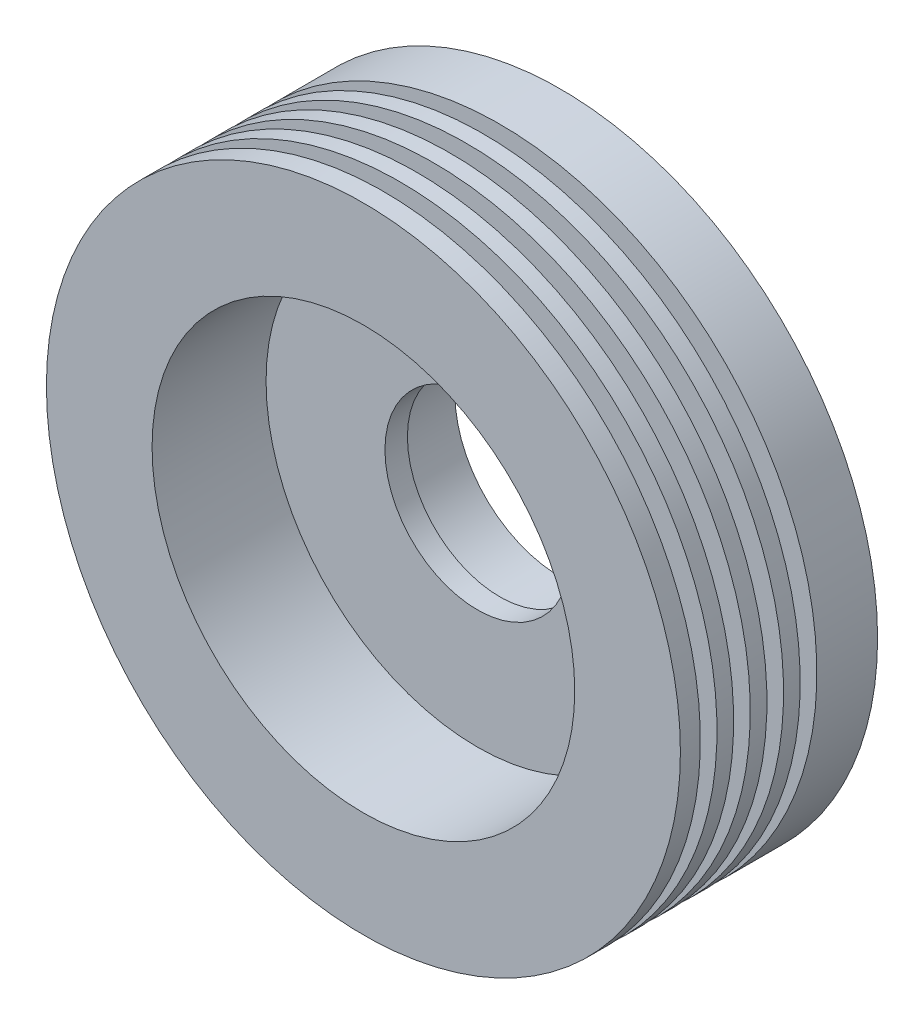
ISO-10303-21;
HEADER;
FILE_DESCRIPTION(('STEP AP214'),'2;1');
FILE_NAME('part.step','',(''),(''),'','','');
FILE_SCHEMA(('AUTOMOTIVE_DESIGN { 1 0 10303 214 1 1 1 1 }'));
ENDSEC;
DATA;
#1=APPLICATION_CONTEXT('core data for automotive mechanical design processes');
#2=APPLICATION_PROTOCOL_DEFINITION('international standard','automotive_design',2000,#1);
#3=PRODUCT_CONTEXT('',#1,'mechanical');
#4=PRODUCT('Part','Part','',(#3));
#5=PRODUCT_RELATED_PRODUCT_CATEGORY('part','',(#4));
#6=PRODUCT_DEFINITION_FORMATION('','',#4);
#7=PRODUCT_DEFINITION_CONTEXT('part definition',#1,'design');
#8=PRODUCT_DEFINITION('design','',#6,#7);
#9=PRODUCT_DEFINITION_SHAPE('','',#8);
#10=(LENGTH_UNIT() NAMED_UNIT(*) SI_UNIT(.MILLI.,.METRE.));
#11=(NAMED_UNIT(*) PLANE_ANGLE_UNIT() SI_UNIT($,.RADIAN.));
#12=(NAMED_UNIT(*) SI_UNIT($,.STERADIAN.) SOLID_ANGLE_UNIT());
#13=UNCERTAINTY_MEASURE_WITH_UNIT(LENGTH_MEASURE(1.E-05),#10,'distance_accuracy_value','');
#14=(GEOMETRIC_REPRESENTATION_CONTEXT(3) GLOBAL_UNCERTAINTY_ASSIGNED_CONTEXT((#13)) GLOBAL_UNIT_ASSIGNED_CONTEXT((#10,
#11,#12)) REPRESENTATION_CONTEXT('',''));
#15=CARTESIAN_POINT('',(0.,0.,0.));
#16=DIRECTION('',(0.,0.,1.));
#17=DIRECTION('',(1.,0.,0.));
#18=AXIS2_PLACEMENT_3D('',#15,#16,#17);
#19=CARTESIAN_POINT('',(0.,0.,23.7));
#20=DIRECTION('',(0.,0.,-1.));
#21=DIRECTION('',(-1.,0.,0.));
#22=AXIS2_PLACEMENT_3D('',#19,#20,#21);
#23=CYLINDRICAL_SURFACE('',#22,38.1);
#24=CARTESIAN_POINT('',(0.,0.,23.7));
#25=DIRECTION('',(0.,0.,1.));
#26=DIRECTION('',(1.,0.,0.));
#27=AXIS2_PLACEMENT_3D('',#24,#25,#26);
#28=CIRCLE('',#27,38.1);
#29=CARTESIAN_POINT('',(38.1,0.,23.7));
#30=VERTEX_POINT('',#29);
#31=EDGE_CURVE('E11',#30,#30,#28,.T.);
#32=ORIENTED_EDGE('',*,*,#31,.F.);
#33=EDGE_LOOP('',(#32));
#34=FACE_BOUND('',#33,.T.);
#35=CARTESIAN_POINT('',(0.,0.,21.3));
#36=DIRECTION('',(0.,0.,-1.));
#37=DIRECTION('',(-1.,0.,0.));
#38=AXIS2_PLACEMENT_3D('',#35,#36,#37);
#39=CIRCLE('',#38,38.1);
#40=CARTESIAN_POINT('',(-38.1,0.,21.3));
#41=VERTEX_POINT('',#40);
#42=EDGE_CURVE('E82',#41,#41,#39,.T.);
#43=ORIENTED_EDGE('',*,*,#42,.F.);
#44=EDGE_LOOP('',(#43));
#45=FACE_BOUND('',#44,.T.);
#46=ADVANCED_FACE('F47',(#34,#45),#23,.T.);
#47=CARTESIAN_POINT('',(0.,0.,11.3));
#48=DIRECTION('',(0.,0.,-1.));
#49=DIRECTION('',(-1.,0.,0.));
#50=AXIS2_PLACEMENT_3D('',#47,#48,#49);
#51=CIRCLE('',#50,38.1);
#52=CARTESIAN_POINT('',(-38.1,0.,11.3));
#53=VERTEX_POINT('',#52);
#54=EDGE_CURVE('E94',#53,#53,#51,.T.);
#55=ORIENTED_EDGE('',*,*,#54,.T.);
#56=EDGE_LOOP('',(#55));
#57=FACE_BOUND('',#56,.T.);
#58=CARTESIAN_POINT('',(0.,0.,9.3));
#59=DIRECTION('',(0.,0.,-1.));
#60=DIRECTION('',(-1.,0.,0.));
#61=AXIS2_PLACEMENT_3D('',#58,#59,#60);
#62=CIRCLE('',#61,38.1);
#63=CARTESIAN_POINT('',(-38.1,0.,9.3));
#64=VERTEX_POINT('',#63);
#65=EDGE_CURVE('E72',#64,#64,#62,.T.);
#66=ORIENTED_EDGE('',*,*,#65,.F.);
#67=EDGE_LOOP('',(#66));
#68=FACE_BOUND('',#67,.T.);
#69=ADVANCED_FACE('F145',(#57,#68),#23,.T.);
#70=CARTESIAN_POINT('',(0.,0.,7.3));
#71=DIRECTION('',(0.,0.,-1.));
#72=DIRECTION('',(-1.,0.,0.));
#73=AXIS2_PLACEMENT_3D('',#70,#71,#72);
#74=CIRCLE('',#73,38.1);
#75=CARTESIAN_POINT('',(-38.1,0.,7.3));
#76=VERTEX_POINT('',#75);
#77=EDGE_CURVE('E68',#76,#76,#74,.T.);
#78=ORIENTED_EDGE('',*,*,#77,.T.);
#79=EDGE_LOOP('',(#78));
#80=FACE_BOUND('',#79,.T.);
#81=CARTESIAN_POINT('',(0.,0.,0.));
#82=DIRECTION('',(0.,0.,1.));
#83=DIRECTION('',(1.,0.,0.));
#84=AXIS2_PLACEMENT_3D('',#81,#82,#83);
#85=CIRCLE('',#84,38.1);
#86=CARTESIAN_POINT('',(38.1,0.,0.));
#87=VERTEX_POINT('',#86);
#88=EDGE_CURVE('E56',#87,#87,#85,.T.);
#89=ORIENTED_EDGE('',*,*,#88,.T.);
#90=EDGE_LOOP('',(#89));
#91=FACE_BOUND('',#90,.T.);
#92=ADVANCED_FACE('F49',(#80,#91),#23,.T.);
#93=CARTESIAN_POINT('',(0.,0.,23.7));
#94=DIRECTION('',(0.,0.,1.));
#95=DIRECTION('',(1.,0.,0.));
#96=AXIS2_PLACEMENT_3D('',#93,#94,#95);
#97=PLANE('',#96);
#98=CARTESIAN_POINT('',(0.,0.,23.7));
#99=DIRECTION('',(0.,0.,-1.));
#100=DIRECTION('',(-1.,0.,0.));
#101=AXIS2_PLACEMENT_3D('',#98,#99,#100);
#102=CIRCLE('',#101,25.4);
#103=CARTESIAN_POINT('',(-25.4,0.,23.7));
#104=VERTEX_POINT('',#103);
#105=EDGE_CURVE('E114',#104,#104,#102,.T.);
#106=ORIENTED_EDGE('',*,*,#105,.T.);
#107=EDGE_LOOP('',(#106));
#108=FACE_BOUND('',#107,.T.);
#109=ORIENTED_EDGE('',*,*,#31,.T.);
#110=EDGE_LOOP('',(#109));
#111=FACE_BOUND('',#110,.T.);
#112=ADVANCED_FACE('F141',(#108,#111),#97,.T.);
#113=CARTESIAN_POINT('',(0.,0.,0.));
#114=DIRECTION('',(0.,0.,1.));
#115=DIRECTION('',(1.,0.,0.));
#116=AXIS2_PLACEMENT_3D('',#113,#114,#115);
#117=PLANE('',#116);
#118=CARTESIAN_POINT('',(0.,0.,0.));
#119=DIRECTION('',(0.,0.,-1.));
#120=DIRECTION('',(-1.,0.,0.));
#121=AXIS2_PLACEMENT_3D('',#118,#119,#120);
#122=CIRCLE('',#121,12.7);
#123=CARTESIAN_POINT('',(-12.7,0.,0.));
#124=VERTEX_POINT('',#123);
#125=EDGE_CURVE('E65',#124,#124,#122,.T.);
#126=ORIENTED_EDGE('',*,*,#125,.F.);
#127=EDGE_LOOP('',(#126));
#128=FACE_BOUND('',#127,.T.);
#129=ORIENTED_EDGE('',*,*,#88,.F.);
#130=EDGE_LOOP('',(#129));
#131=FACE_BOUND('',#130,.T.);
#132=ADVANCED_FACE('F138',(#128,#131),#117,.F.);
#133=CARTESIAN_POINT('',(0.,0.,7.3));
#134=DIRECTION('',(0.,0.,-1.));
#135=DIRECTION('',(-1.,0.,0.));
#136=AXIS2_PLACEMENT_3D('',#133,#134,#135);
#137=CYLINDRICAL_SURFACE('',#136,12.7);
#138=CARTESIAN_POINT('',(0.,0.,7.3));
#139=DIRECTION('',(0.,0.,-1.));
#140=DIRECTION('',(-1.,0.,0.));
#141=AXIS2_PLACEMENT_3D('',#138,#139,#140);
#142=CIRCLE('',#141,12.7);
#143=CARTESIAN_POINT('',(-12.7,0.,7.3));
#144=VERTEX_POINT('',#143);
#145=EDGE_CURVE('E62',#144,#144,#142,.T.);
#146=ORIENTED_EDGE('',*,*,#145,.F.);
#147=EDGE_LOOP('',(#146));
#148=FACE_BOUND('',#147,.T.);
#149=ORIENTED_EDGE('',*,*,#125,.T.);
#150=EDGE_LOOP('',(#149));
#151=FACE_BOUND('',#150,.T.);
#152=ADVANCED_FACE('F136',(#148,#151),#137,.F.);
#153=CARTESIAN_POINT('',(0.,0.,7.3));
#154=DIRECTION('',(0.,0.,-1.));
#155=DIRECTION('',(-1.,0.,0.));
#156=AXIS2_PLACEMENT_3D('',#153,#154,#155);
#157=PLANE('',#156);
#158=CARTESIAN_POINT('',(0.,0.,7.3));
#159=DIRECTION('',(0.,0.,-1.));
#160=DIRECTION('',(-1.,0.,0.));
#161=AXIS2_PLACEMENT_3D('',#158,#159,#160);
#162=CIRCLE('',#161,11.1125);
#163=CARTESIAN_POINT('',(-11.1125,0.,7.3));
#164=VERTEX_POINT('',#163);
#165=EDGE_CURVE('E125',#164,#164,#162,.T.);
#166=ORIENTED_EDGE('',*,*,#165,.F.);
#167=EDGE_LOOP('',(#166));
#168=FACE_BOUND('',#167,.T.);
#169=ORIENTED_EDGE('',*,*,#145,.T.);
#170=EDGE_LOOP('',(#169));
#171=FACE_BOUND('',#170,.T.);
#172=ADVANCED_FACE('F225',(#168,#171),#157,.T.);
#173=CARTESIAN_POINT('',(0.,0.,10.));
#174=DIRECTION('',(0.,0.,-1.));
#175=DIRECTION('',(-1.,0.,0.));
#176=AXIS2_PLACEMENT_3D('',#173,#174,#175);
#177=CYLINDRICAL_SURFACE('',#176,11.1125);
#178=CARTESIAN_POINT('',(0.,0.,10.));
#179=DIRECTION('',(0.,0.,-1.));
#180=DIRECTION('',(-1.,0.,0.));
#181=AXIS2_PLACEMENT_3D('',#178,#179,#180);
#182=CIRCLE('',#181,11.1125);
#183=CARTESIAN_POINT('',(-11.1125,0.,10.));
#184=VERTEX_POINT('',#183);
#185=EDGE_CURVE('E118',#184,#184,#182,.T.);
#186=CARTESIAN_POINT('',(-11.1125,0.,10.));
#187=CARTESIAN_POINT('',(-11.1125,0.,9.971875));
#188=CARTESIAN_POINT('',(-11.1125,0.,9.94375));
#189=CARTESIAN_POINT('',(-11.1125,0.,9.8875));
#190=CARTESIAN_POINT('',(-11.1125,0.,9.859375));
#191=CARTESIAN_POINT('',(-11.1125,0.,9.803125));
#192=CARTESIAN_POINT('',(-11.1125,0.,9.775));
#193=CARTESIAN_POINT('',(-11.1125,0.,9.71875));
#194=CARTESIAN_POINT('',(-11.1125,0.,9.690625));
#195=CARTESIAN_POINT('',(-11.1125,0.,9.634375));
#196=CARTESIAN_POINT('',(-11.1125,0.,9.60625));
#197=CARTESIAN_POINT('',(-11.1125,0.,9.55));
#198=CARTESIAN_POINT('',(-11.1125,0.,9.521875));
#199=CARTESIAN_POINT('',(-11.1125,0.,9.465625));
#200=CARTESIAN_POINT('',(-11.1125,0.,9.4375));
#201=CARTESIAN_POINT('',(-11.1125,0.,9.38125));
#202=CARTESIAN_POINT('',(-11.1125,0.,9.353125));
#203=CARTESIAN_POINT('',(-11.1125,0.,9.296875));
#204=CARTESIAN_POINT('',(-11.1125,0.,9.26875));
#205=CARTESIAN_POINT('',(-11.1125,0.,9.2125));
#206=CARTESIAN_POINT('',(-11.1125,0.,9.184375));
#207=CARTESIAN_POINT('',(-11.1125,0.,9.128125));
#208=CARTESIAN_POINT('',(-11.1125,0.,9.1));
#209=CARTESIAN_POINT('',(-11.1125,0.,9.04375));
#210=CARTESIAN_POINT('',(-11.1125,0.,9.015625));
#211=CARTESIAN_POINT('',(-11.1125,0.,8.959375));
#212=CARTESIAN_POINT('',(-11.1125,0.,8.93125));
#213=CARTESIAN_POINT('',(-11.1125,0.,8.875));
#214=CARTESIAN_POINT('',(-11.1125,0.,8.846875));
#215=CARTESIAN_POINT('',(-11.1125,0.,8.790625));
#216=CARTESIAN_POINT('',(-11.1125,0.,8.7625));
#217=CARTESIAN_POINT('',(-11.1125,0.,8.70625));
#218=CARTESIAN_POINT('',(-11.1125,0.,8.678125));
#219=CARTESIAN_POINT('',(-11.1125,0.,8.621875));
#220=CARTESIAN_POINT('',(-11.1125,0.,8.59375));
#221=CARTESIAN_POINT('',(-11.1125,0.,8.5375));
#222=CARTESIAN_POINT('',(-11.1125,0.,8.509375));
#223=CARTESIAN_POINT('',(-11.1125,0.,8.453125));
#224=CARTESIAN_POINT('',(-11.1125,0.,8.425));
#225=CARTESIAN_POINT('',(-11.1125,0.,8.36875));
#226=CARTESIAN_POINT('',(-11.1125,0.,8.340625));
#227=CARTESIAN_POINT('',(-11.1125,0.,8.284375));
#228=CARTESIAN_POINT('',(-11.1125,0.,8.25625));
#229=CARTESIAN_POINT('',(-11.1125,0.,8.2));
#230=CARTESIAN_POINT('',(-11.1125,0.,8.171875));
#231=CARTESIAN_POINT('',(-11.1125,0.,8.115625));
#232=CARTESIAN_POINT('',(-11.1125,0.,8.0875));
#233=CARTESIAN_POINT('',(-11.1125,0.,8.03125));
#234=CARTESIAN_POINT('',(-11.1125,0.,8.003125));
#235=CARTESIAN_POINT('',(-11.1125,0.,7.946875));
#236=CARTESIAN_POINT('',(-11.1125,0.,7.91875));
#237=CARTESIAN_POINT('',(-11.1125,0.,7.8625));
#238=CARTESIAN_POINT('',(-11.1125,0.,7.834375));
#239=CARTESIAN_POINT('',(-11.1125,0.,7.778125));
#240=CARTESIAN_POINT('',(-11.1125,0.,7.75));
#241=CARTESIAN_POINT('',(-11.1125,0.,7.69375));
#242=CARTESIAN_POINT('',(-11.1125,0.,7.665625));
#243=CARTESIAN_POINT('',(-11.1125,0.,7.609375));
#244=CARTESIAN_POINT('',(-11.1125,0.,7.58125));
#245=CARTESIAN_POINT('',(-11.1125,0.,7.525));
#246=CARTESIAN_POINT('',(-11.1125,0.,7.496875));
#247=CARTESIAN_POINT('',(-11.1125,0.,7.440625));
#248=CARTESIAN_POINT('',(-11.1125,0.,7.4125));
#249=CARTESIAN_POINT('',(-11.1125,0.,7.35625));
#250=CARTESIAN_POINT('',(-11.1125,0.,7.328125));
#251=CARTESIAN_POINT('',(-11.1125,0.,7.3));
#252=B_SPLINE_CURVE_WITH_KNOTS('',3,(#186,#187,#188,#189,#190,#191,#192,#193,#194,#195,#196,
#197,#198,#199,#200,#201,#202,#203,#204,#205,#206,#207,#208,#209,#210,#211,#212,#213,#214,#215,
#216,#217,#218,#219,#220,#221,#222,#223,#224,#225,#226,#227,#228,#229,#230,#231,#232,#233,#234,
#235,#236,#237,#238,#239,#240,#241,#242,#243,#244,#245,#246,#247,#248,#249,#250,#251),
.UNSPECIFIED.,.F.,.F.,(4,2,2,2,2,2,2,2,2,2,2,2,2,2,2,2,2,2,2,2,2,2,2,2,2,2,2,2,2,2,2,2,4),(0.,
0.0843749999999994,0.168749999999999,0.253125,0.337499999999999,0.421874999999999,0.50625,
0.590624999999999,0.674999999999998,0.759375,0.843749999999999,0.928125,1.0125,1.096875,1.18125,
1.265625,1.35,1.434375,1.51875,1.603125,1.6875,1.771875,1.85625,1.940625,2.025,2.109375,2.19375,
2.278125,2.3625,2.446875,2.53125,2.615625,2.7),.UNSPECIFIED.);
#253=EDGE_CURVE('BSEAM221',#184,#164,#252,.T.);
#254=ORIENTED_EDGE('',*,*,#185,.F.);
#255=ORIENTED_EDGE('',*,*,#165,.T.);
#256=ORIENTED_EDGE('',*,*,#253,.T.);
#257=ORIENTED_EDGE('',*,*,#253,.F.);
#258=EDGE_LOOP('',(#254,#256,#255,#257));
#259=FACE_BOUND('',#258,.T.);
#260=ADVANCED_FACE('F221',(#259),#177,.F.);
#261=CARTESIAN_POINT('',(0.,0.,23.7));
#262=DIRECTION('',(0.,0.,-1.));
#263=DIRECTION('',(-1.,0.,0.));
#264=AXIS2_PLACEMENT_3D('',#261,#262,#263);
#265=CYLINDRICAL_SURFACE('',#264,25.4);
#266=CARTESIAN_POINT('',(0.,0.,10.));
#267=DIRECTION('',(0.,0.,-1.));
#268=DIRECTION('',(-1.,0.,0.));
#269=AXIS2_PLACEMENT_3D('',#266,#267,#268);
#270=CIRCLE('',#269,25.4);
#271=CARTESIAN_POINT('',(-25.4,0.,10.));
#272=VERTEX_POINT('',#271);
#273=EDGE_CURVE('E77',#272,#272,#270,.T.);
#274=CARTESIAN_POINT('',(-25.4,0.,23.7));
#275=CARTESIAN_POINT('',(-25.4,0.,23.5572916666667));
#276=CARTESIAN_POINT('',(-25.4,0.,23.4145833333333));
#277=CARTESIAN_POINT('',(-25.4,0.,23.1291666666667));
#278=CARTESIAN_POINT('',(-25.4,0.,22.9864583333333));
#279=CARTESIAN_POINT('',(-25.4,0.,22.7010416666667));
#280=CARTESIAN_POINT('',(-25.4,0.,22.5583333333333));
#281=CARTESIAN_POINT('',(-25.4,0.,22.2729166666667));
#282=CARTESIAN_POINT('',(-25.4,0.,22.1302083333333));
#283=CARTESIAN_POINT('',(-25.4,0.,21.8447916666667));
#284=CARTESIAN_POINT('',(-25.4,0.,21.7020833333333));
#285=CARTESIAN_POINT('',(-25.4,0.,21.4166666666667));
#286=CARTESIAN_POINT('',(-25.4,0.,21.2739583333333));
#287=CARTESIAN_POINT('',(-25.4,0.,20.9885416666667));
#288=CARTESIAN_POINT('',(-25.4,0.,20.8458333333333));
#289=CARTESIAN_POINT('',(-25.4,0.,20.5604166666667));
#290=CARTESIAN_POINT('',(-25.4,0.,20.4177083333333));
#291=CARTESIAN_POINT('',(-25.4,0.,20.1322916666667));
#292=CARTESIAN_POINT('',(-25.4,0.,19.9895833333333));
#293=CARTESIAN_POINT('',(-25.4,0.,19.7041666666667));
#294=CARTESIAN_POINT('',(-25.4,0.,19.5614583333333));
#295=CARTESIAN_POINT('',(-25.4,0.,19.2760416666667));
#296=CARTESIAN_POINT('',(-25.4,0.,19.1333333333333));
#297=CARTESIAN_POINT('',(-25.4,0.,18.8479166666667));
#298=CARTESIAN_POINT('',(-25.4,0.,18.7052083333333));
#299=CARTESIAN_POINT('',(-25.4,0.,18.4197916666667));
#300=CARTESIAN_POINT('',(-25.4,0.,18.2770833333333));
#301=CARTESIAN_POINT('',(-25.4,0.,17.9916666666667));
#302=CARTESIAN_POINT('',(-25.4,0.,17.8489583333333));
#303=CARTESIAN_POINT('',(-25.4,0.,17.5635416666667));
#304=CARTESIAN_POINT('',(-25.4,0.,17.4208333333333));
#305=CARTESIAN_POINT('',(-25.4,0.,17.1354166666667));
#306=CARTESIAN_POINT('',(-25.4,0.,16.9927083333333));
#307=CARTESIAN_POINT('',(-25.4,0.,16.7072916666667));
#308=CARTESIAN_POINT('',(-25.4,0.,16.5645833333333));
#309=CARTESIAN_POINT('',(-25.4,0.,16.2791666666667));
#310=CARTESIAN_POINT('',(-25.4,0.,16.1364583333333));
#311=CARTESIAN_POINT('',(-25.4,0.,15.8510416666667));
#312=CARTESIAN_POINT('',(-25.4,0.,15.7083333333333));
#313=CARTESIAN_POINT('',(-25.4,0.,15.4229166666667));
#314=CARTESIAN_POINT('',(-25.4,0.,15.2802083333333));
#315=CARTESIAN_POINT('',(-25.4,0.,14.9947916666667));
#316=CARTESIAN_POINT('',(-25.4,0.,14.8520833333333));
#317=CARTESIAN_POINT('',(-25.4,0.,14.5666666666667));
#318=CARTESIAN_POINT('',(-25.4,0.,14.4239583333333));
#319=CARTESIAN_POINT('',(-25.4,0.,14.1385416666667));
#320=CARTESIAN_POINT('',(-25.4,0.,13.9958333333333));
#321=CARTESIAN_POINT('',(-25.4,0.,13.7104166666667));
#322=CARTESIAN_POINT('',(-25.4,0.,13.5677083333333));
#323=CARTESIAN_POINT('',(-25.4,0.,13.2822916666667));
#324=CARTESIAN_POINT('',(-25.4,0.,13.1395833333333));
#325=CARTESIAN_POINT('',(-25.4,0.,12.8541666666667));
#326=CARTESIAN_POINT('',(-25.4,0.,12.7114583333333));
#327=CARTESIAN_POINT('',(-25.4,0.,12.4260416666667));
#328=CARTESIAN_POINT('',(-25.4,0.,12.2833333333333));
#329=CARTESIAN_POINT('',(-25.4,0.,11.9979166666667));
#330=CARTESIAN_POINT('',(-25.4,0.,11.8552083333333));
#331=CARTESIAN_POINT('',(-25.4,0.,11.5697916666667));
#332=CARTESIAN_POINT('',(-25.4,0.,11.4270833333333));
#333=CARTESIAN_POINT('',(-25.4,0.,11.1416666666667));
#334=CARTESIAN_POINT('',(-25.4,0.,10.9989583333333));
#335=CARTESIAN_POINT('',(-25.4,0.,10.7135416666667));
#336=CARTESIAN_POINT('',(-25.4,0.,10.5708333333333));
#337=CARTESIAN_POINT('',(-25.4,0.,10.2854166666667));
#338=CARTESIAN_POINT('',(-25.4,0.,10.1427083333333));
#339=CARTESIAN_POINT('',(-25.4,0.,10.));
#340=B_SPLINE_CURVE_WITH_KNOTS('',3,(#274,#275,#276,#277,#278,#279,#280,#281,#282,#283,#284,
#285,#286,#287,#288,#289,#290,#291,#292,#293,#294,#295,#296,#297,#298,#299,#300,#301,#302,#303,
#304,#305,#306,#307,#308,#309,#310,#311,#312,#313,#314,#315,#316,#317,#318,#319,#320,#321,#322,
#323,#324,#325,#326,#327,#328,#329,#330,#331,#332,#333,#334,#335,#336,#337,#338,#339),
.UNSPECIFIED.,.F.,.F.,(4,2,2,2,2,2,2,2,2,2,2,2,2,2,2,2,2,2,2,2,2,2,2,2,2,2,2,2,2,2,2,2,4),(0.,
0.428124999999998,0.856249999999999,1.284375,1.7125,2.140625,2.56875,2.996875,3.425,3.853125,
4.28125,4.709375,5.1375,5.565625,5.99375,6.421875,6.85,7.278125,7.70625,8.134375,8.5625,
8.990625,9.41875,9.846875,10.275,10.703125,11.13125,11.559375,11.9875,12.415625,12.84375,
13.271875,13.7),.UNSPECIFIED.);
#341=EDGE_CURVE('BSEAM217',#104,#272,#340,.T.);
#342=ORIENTED_EDGE('',*,*,#105,.F.);
#343=ORIENTED_EDGE('',*,*,#273,.T.);
#344=ORIENTED_EDGE('',*,*,#341,.T.);
#345=ORIENTED_EDGE('',*,*,#341,.F.);
#346=EDGE_LOOP('',(#342,#344,#343,#345));
#347=FACE_BOUND('',#346,.T.);
#348=ADVANCED_FACE('F217',(#347),#265,.F.);
#349=CARTESIAN_POINT('',(0.,0.,10.));
#350=DIRECTION('',(0.,0.,-1.));
#351=DIRECTION('',(-1.,0.,0.));
#352=AXIS2_PLACEMENT_3D('',#349,#350,#351);
#353=PLANE('',#352);
#354=ORIENTED_EDGE('',*,*,#185,.T.);
#355=EDGE_LOOP('',(#354));
#356=FACE_BOUND('',#355,.T.);
#357=ORIENTED_EDGE('',*,*,#273,.F.);
#358=EDGE_LOOP('',(#357));
#359=FACE_BOUND('',#358,.T.);
#360=ADVANCED_FACE('F211',(#356,#359),#353,.F.);
#361=CARTESIAN_POINT('',(0.,0.,9.3));
#362=DIRECTION('',(0.,0.,-1.));
#363=DIRECTION('',(-1.,0.,0.));
#364=AXIS2_PLACEMENT_3D('',#361,#362,#363);
#365=PLANE('',#364);
#366=CARTESIAN_POINT('',(0.,0.,9.3));
#367=DIRECTION('',(0.,0.,-1.));
#368=DIRECTION('',(-1.,0.,0.));
#369=AXIS2_PLACEMENT_3D('',#366,#367,#368);
#370=CIRCLE('',#369,34.925);
#371=CARTESIAN_POINT('',(-34.925,0.,9.3));
#372=VERTEX_POINT('',#371);
#373=EDGE_CURVE('E73',#372,#372,#370,.T.);
#374=ORIENTED_EDGE('',*,*,#373,.F.);
#375=EDGE_LOOP('',(#374));
#376=FACE_BOUND('',#375,.T.);
#377=ORIENTED_EDGE('',*,*,#65,.T.);
#378=EDGE_LOOP('',(#377));
#379=FACE_BOUND('',#378,.T.);
#380=ADVANCED_FACE('F208',(#376,#379),#365,.T.);
#381=CARTESIAN_POINT('',(0.,0.,7.3));
#382=DIRECTION('',(0.,0.,-1.));
#383=DIRECTION('',(-1.,0.,0.));
#384=AXIS2_PLACEMENT_3D('',#381,#382,#383);
#385=PLANE('',#384);
#386=CARTESIAN_POINT('',(0.,0.,7.3));
#387=DIRECTION('',(0.,0.,-1.));
#388=DIRECTION('',(-1.,0.,0.));
#389=AXIS2_PLACEMENT_3D('',#386,#387,#388);
#390=CIRCLE('',#389,34.925);
#391=CARTESIAN_POINT('',(-34.925,0.,7.3));
#392=VERTEX_POINT('',#391);
#393=EDGE_CURVE('E101',#392,#392,#390,.T.);
#394=ORIENTED_EDGE('',*,*,#393,.T.);
#395=EDGE_LOOP('',(#394));
#396=FACE_BOUND('',#395,.T.);
#397=ORIENTED_EDGE('',*,*,#77,.F.);
#398=EDGE_LOOP('',(#397));
#399=FACE_BOUND('',#398,.T.);
#400=ADVANCED_FACE('F206',(#396,#399),#385,.F.);
#401=CARTESIAN_POINT('',(0.,0.,9.3));
#402=DIRECTION('',(0.,0.,-1.));
#403=DIRECTION('',(-1.,0.,0.));
#404=AXIS2_PLACEMENT_3D('',#401,#402,#403);
#405=CYLINDRICAL_SURFACE('',#404,34.925);
#406=ORIENTED_EDGE('',*,*,#373,.T.);
#407=EDGE_LOOP('',(#406));
#408=FACE_BOUND('',#407,.T.);
#409=ORIENTED_EDGE('',*,*,#393,.F.);
#410=EDGE_LOOP('',(#409));
#411=FACE_BOUND('',#410,.T.);
#412=ADVANCED_FACE('F199',(#408,#411),#405,.T.);
#413=CARTESIAN_POINT('',(0.,0.,21.3));
#414=DIRECTION('',(0.,0.,-1.));
#415=DIRECTION('',(-1.,0.,0.));
#416=AXIS2_PLACEMENT_3D('',#413,#414,#415);
#417=PLANE('',#416);
#418=CARTESIAN_POINT('',(0.,0.,21.3));
#419=DIRECTION('',(0.,0.,-1.));
#420=DIRECTION('',(-1.,0.,0.));
#421=AXIS2_PLACEMENT_3D('',#418,#419,#420);
#422=CIRCLE('',#421,34.925);
#423=CARTESIAN_POINT('',(-34.925,0.,21.3));
#424=VERTEX_POINT('',#423);
#425=EDGE_CURVE('E383',#424,#424,#422,.T.);
#426=ORIENTED_EDGE('',*,*,#425,.F.);
#427=EDGE_LOOP('',(#426));
#428=FACE_BOUND('',#427,.T.);
#429=ORIENTED_EDGE('',*,*,#42,.T.);
#430=EDGE_LOOP('',(#429));
#431=FACE_BOUND('',#430,.T.);
#432=ADVANCED_FACE('F196',(#428,#431),#417,.T.);
#433=CARTESIAN_POINT('',(0.,0.,19.3));
#434=DIRECTION('',(0.,0.,-1.));
#435=DIRECTION('',(-1.,0.,0.));
#436=AXIS2_PLACEMENT_3D('',#433,#434,#435);
#437=PLANE('',#436);
#438=CARTESIAN_POINT('',(0.,0.,19.3));
#439=DIRECTION('',(0.,0.,-1.));
#440=DIRECTION('',(-1.,0.,0.));
#441=AXIS2_PLACEMENT_3D('',#438,#439,#440);
#442=CIRCLE('',#441,34.925);
#443=CARTESIAN_POINT('',(-34.925,0.,19.3));
#444=VERTEX_POINT('',#443);
#445=EDGE_CURVE('E390',#444,#444,#442,.T.);
#446=ORIENTED_EDGE('',*,*,#445,.T.);
#447=EDGE_LOOP('',(#446));
#448=FACE_BOUND('',#447,.T.);
#449=CARTESIAN_POINT('',(0.,0.,19.3));
#450=DIRECTION('',(0.,0.,-1.));
#451=DIRECTION('',(-1.,0.,0.));
#452=AXIS2_PLACEMENT_3D('',#449,#450,#451);
#453=CIRCLE('',#452,38.1);
#454=CARTESIAN_POINT('',(-38.1,0.,19.3));
#455=VERTEX_POINT('',#454);
#456=EDGE_CURVE('E78',#455,#455,#453,.T.);
#457=ORIENTED_EDGE('',*,*,#456,.F.);
#458=EDGE_LOOP('',(#457));
#459=FACE_BOUND('',#458,.T.);
#460=ADVANCED_FACE('F194',(#448,#459),#437,.F.);
#461=CARTESIAN_POINT('',(0.,0.,21.3));
#462=DIRECTION('',(0.,0.,-1.));
#463=DIRECTION('',(-1.,0.,0.));
#464=AXIS2_PLACEMENT_3D('',#461,#462,#463);
#465=CYLINDRICAL_SURFACE('',#464,34.925);
#466=ORIENTED_EDGE('',*,*,#425,.T.);
#467=EDGE_LOOP('',(#466));
#468=FACE_BOUND('',#467,.T.);
#469=ORIENTED_EDGE('',*,*,#445,.F.);
#470=EDGE_LOOP('',(#469));
#471=FACE_BOUND('',#470,.T.);
#472=ADVANCED_FACE('F190',(#468,#471),#465,.T.);
#473=CARTESIAN_POINT('',(0.,0.,13.3));
#474=DIRECTION('',(0.,0.,-1.));
#475=DIRECTION('',(-1.,0.,0.));
#476=AXIS2_PLACEMENT_3D('',#473,#474,#475);
#477=PLANE('',#476);
#478=CARTESIAN_POINT('',(0.,0.,13.3));
#479=DIRECTION('',(0.,0.,-1.));
#480=DIRECTION('',(-1.,0.,0.));
#481=AXIS2_PLACEMENT_3D('',#478,#479,#480);
#482=CIRCLE('',#481,34.925);
#483=CARTESIAN_POINT('',(-34.925,0.,13.3));
#484=VERTEX_POINT('',#483);
#485=EDGE_CURVE('E83',#484,#484,#482,.T.);
#486=ORIENTED_EDGE('',*,*,#485,.F.);
#487=EDGE_LOOP('',(#486));
#488=FACE_BOUND('',#487,.T.);
#489=CARTESIAN_POINT('',(0.,0.,13.3));
#490=DIRECTION('',(0.,0.,-1.));
#491=DIRECTION('',(-1.,0.,0.));
#492=AXIS2_PLACEMENT_3D('',#489,#490,#491);
#493=CIRCLE('',#492,38.1);
#494=CARTESIAN_POINT('',(-38.1,0.,13.3));
#495=VERTEX_POINT('',#494);
#496=EDGE_CURVE('E51',#495,#495,#493,.T.);
#497=ORIENTED_EDGE('',*,*,#496,.T.);
#498=EDGE_LOOP('',(#497));
#499=FACE_BOUND('',#498,.T.);
#500=ADVANCED_FACE('F193',(#488,#499),#477,.T.);
#501=CARTESIAN_POINT('',(0.,0.,11.3));
#502=DIRECTION('',(0.,0.,-1.));
#503=DIRECTION('',(-1.,0.,0.));
#504=AXIS2_PLACEMENT_3D('',#501,#502,#503);
#505=PLANE('',#504);
#506=CARTESIAN_POINT('',(0.,0.,11.3));
#507=DIRECTION('',(0.,0.,-1.));
#508=DIRECTION('',(-1.,0.,0.));
#509=AXIS2_PLACEMENT_3D('',#506,#507,#508);
#510=CIRCLE('',#509,34.925);
#511=CARTESIAN_POINT('',(-34.925,0.,11.3));
#512=VERTEX_POINT('',#511);
#513=EDGE_CURVE('E387',#512,#512,#510,.T.);
#514=ORIENTED_EDGE('',*,*,#513,.T.);
#515=EDGE_LOOP('',(#514));
#516=FACE_BOUND('',#515,.T.);
#517=ORIENTED_EDGE('',*,*,#54,.F.);
#518=EDGE_LOOP('',(#517));
#519=FACE_BOUND('',#518,.T.);
#520=ADVANCED_FACE('F169',(#516,#519),#505,.F.);
#521=CARTESIAN_POINT('',(0.,0.,13.3));
#522=DIRECTION('',(0.,0.,-1.));
#523=DIRECTION('',(-1.,0.,0.));
#524=AXIS2_PLACEMENT_3D('',#521,#522,#523);
#525=CYLINDRICAL_SURFACE('',#524,34.925);
#526=ORIENTED_EDGE('',*,*,#485,.T.);
#527=EDGE_LOOP('',(#526));
#528=FACE_BOUND('',#527,.T.);
#529=ORIENTED_EDGE('',*,*,#513,.F.);
#530=EDGE_LOOP('',(#529));
#531=FACE_BOUND('',#530,.T.);
#532=ADVANCED_FACE('F164',(#528,#531),#525,.T.);
#533=ORIENTED_EDGE('',*,*,#456,.T.);
#534=EDGE_LOOP('',(#533));
#535=FACE_BOUND('',#534,.T.);
#536=CARTESIAN_POINT('',(0.,0.,17.3));
#537=DIRECTION('',(0.,0.,-1.));
#538=DIRECTION('',(-1.,0.,0.));
#539=AXIS2_PLACEMENT_3D('',#536,#537,#538);
#540=CIRCLE('',#539,38.1);
#541=CARTESIAN_POINT('',(-38.1,0.,17.3));
#542=VERTEX_POINT('',#541);
#543=EDGE_CURVE('E91',#542,#542,#540,.T.);
#544=ORIENTED_EDGE('',*,*,#543,.F.);
#545=EDGE_LOOP('',(#544));
#546=FACE_BOUND('',#545,.T.);
#547=ADVANCED_FACE('F157',(#535,#546),#23,.T.);
#548=CARTESIAN_POINT('',(0.,0.,15.3));
#549=DIRECTION('',(0.,0.,-1.));
#550=DIRECTION('',(-1.,0.,0.));
#551=AXIS2_PLACEMENT_3D('',#548,#549,#550);
#552=CIRCLE('',#551,38.1);
#553=CARTESIAN_POINT('',(-38.1,0.,15.3));
#554=VERTEX_POINT('',#553);
#555=EDGE_CURVE('E87',#554,#554,#552,.T.);
#556=ORIENTED_EDGE('',*,*,#555,.T.);
#557=EDGE_LOOP('',(#556));
#558=FACE_BOUND('',#557,.T.);
#559=ORIENTED_EDGE('',*,*,#496,.F.);
#560=EDGE_LOOP('',(#559));
#561=FACE_BOUND('',#560,.T.);
#562=ADVANCED_FACE('F147',(#558,#561),#23,.T.);
#563=CARTESIAN_POINT('',(0.,0.,17.3));
#564=DIRECTION('',(0.,0.,-1.));
#565=DIRECTION('',(-1.,0.,0.));
#566=AXIS2_PLACEMENT_3D('',#563,#564,#565);
#567=PLANE('',#566);
#568=CARTESIAN_POINT('',(0.,0.,17.3));
#569=DIRECTION('',(0.,0.,-1.));
#570=DIRECTION('',(-1.,0.,0.));
#571=AXIS2_PLACEMENT_3D('',#568,#569,#570);
#572=CIRCLE('',#571,34.925);
#573=CARTESIAN_POINT('',(-34.925,0.,17.3));
#574=VERTEX_POINT('',#573);
#575=EDGE_CURVE('E378',#574,#574,#572,.T.);
#576=ORIENTED_EDGE('',*,*,#575,.F.);
#577=EDGE_LOOP('',(#576));
#578=FACE_BOUND('',#577,.T.);
#579=ORIENTED_EDGE('',*,*,#543,.T.);
#580=EDGE_LOOP('',(#579));
#581=FACE_BOUND('',#580,.T.);
#582=ADVANCED_FACE('F156',(#578,#581),#567,.T.);
#583=CARTESIAN_POINT('',(0.,0.,15.3));
#584=DIRECTION('',(0.,0.,-1.));
#585=DIRECTION('',(-1.,0.,0.));
#586=AXIS2_PLACEMENT_3D('',#583,#584,#585);
#587=PLANE('',#586);
#588=CARTESIAN_POINT('',(0.,0.,15.3));
#589=DIRECTION('',(0.,0.,-1.));
#590=DIRECTION('',(-1.,0.,0.));
#591=AXIS2_PLACEMENT_3D('',#588,#589,#590);
#592=CIRCLE('',#591,34.925);
#593=CARTESIAN_POINT('',(-34.925,0.,15.3));
#594=VERTEX_POINT('',#593);
#595=EDGE_CURVE('E381',#594,#594,#592,.T.);
#596=ORIENTED_EDGE('',*,*,#595,.T.);
#597=EDGE_LOOP('',(#596));
#598=FACE_BOUND('',#597,.T.);
#599=ORIENTED_EDGE('',*,*,#555,.F.);
#600=EDGE_LOOP('',(#599));
#601=FACE_BOUND('',#600,.T.);
#602=ADVANCED_FACE('F177',(#598,#601),#587,.F.);
#603=CARTESIAN_POINT('',(0.,0.,17.3));
#604=DIRECTION('',(0.,0.,-1.));
#605=DIRECTION('',(-1.,0.,0.));
#606=AXIS2_PLACEMENT_3D('',#603,#604,#605);
#607=CYLINDRICAL_SURFACE('',#606,34.925);
#608=ORIENTED_EDGE('',*,*,#575,.T.);
#609=EDGE_LOOP('',(#608));
#610=FACE_BOUND('',#609,.T.);
#611=ORIENTED_EDGE('',*,*,#595,.F.);
#612=EDGE_LOOP('',(#611));
#613=FACE_BOUND('',#612,.T.);
#614=ADVANCED_FACE('F183',(#610,#613),#607,.T.);
#615=CLOSED_SHELL('',(#46,#69,#92,#112,#132,#152,#172,#260,#348,#360,#380,#400,#412,#432,#460,
#472,#500,#520,#532,#547,#562,#582,#602,#614));
#616=MANIFOLD_SOLID_BREP('B2',#615);
#617=ADVANCED_BREP_SHAPE_REPRESENTATION('',(#18,#616),#14);
#618=SHAPE_DEFINITION_REPRESENTATION(#9,#617);
ENDSEC;
END-ISO-10303-21;
